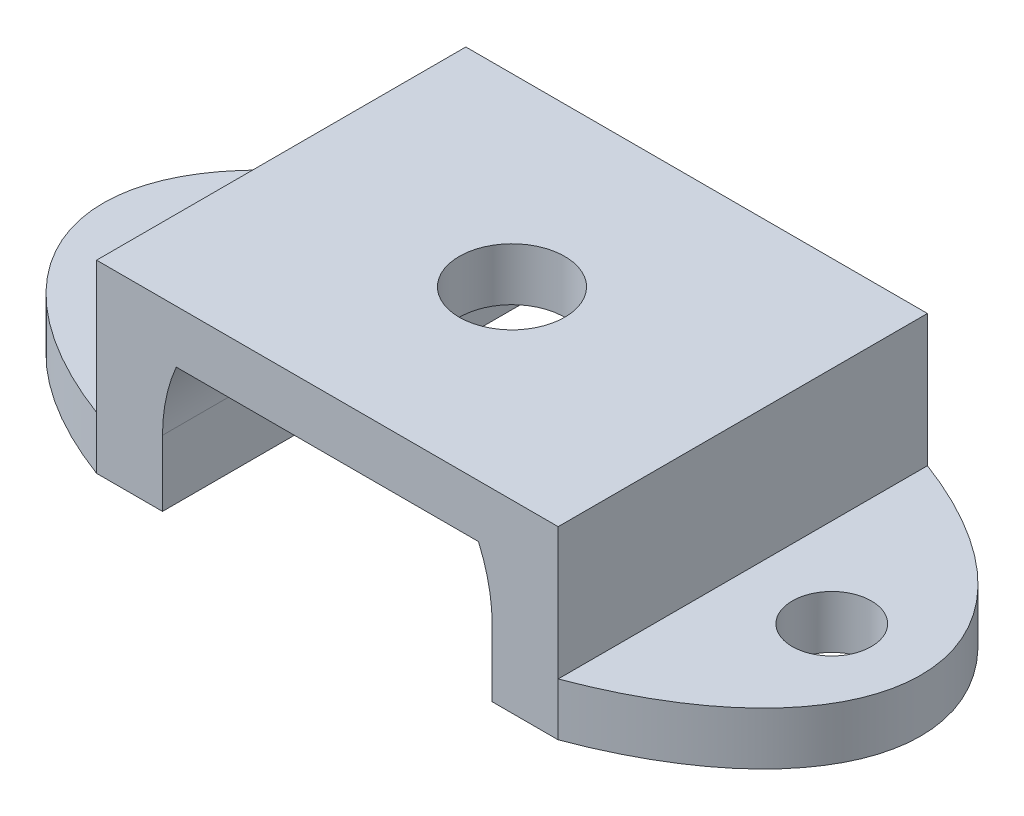
ISO-10303-21;
HEADER;
FILE_DESCRIPTION(('STEP AP214'),'2;1');
FILE_NAME('part.step','',(''),(''),'','','');
FILE_SCHEMA(('AUTOMOTIVE_DESIGN { 1 0 10303 214 1 1 1 1 }'));
ENDSEC;
DATA;
#1=APPLICATION_CONTEXT('core data for automotive mechanical design processes');
#2=APPLICATION_PROTOCOL_DEFINITION('international standard','automotive_design',2000,#1);
#3=PRODUCT_CONTEXT('',#1,'mechanical');
#4=PRODUCT('Part','Part','',(#3));
#5=PRODUCT_RELATED_PRODUCT_CATEGORY('part','',(#4));
#6=PRODUCT_DEFINITION_FORMATION('','',#4);
#7=PRODUCT_DEFINITION_CONTEXT('part definition',#1,'design');
#8=PRODUCT_DEFINITION('design','',#6,#7);
#9=PRODUCT_DEFINITION_SHAPE('','',#8);
#10=(LENGTH_UNIT() NAMED_UNIT(*) SI_UNIT(.MILLI.,.METRE.));
#11=(NAMED_UNIT(*) PLANE_ANGLE_UNIT() SI_UNIT($,.RADIAN.));
#12=(NAMED_UNIT(*) SI_UNIT($,.STERADIAN.) SOLID_ANGLE_UNIT());
#13=UNCERTAINTY_MEASURE_WITH_UNIT(LENGTH_MEASURE(1.E-05),#10,'distance_accuracy_value','');
#14=(GEOMETRIC_REPRESENTATION_CONTEXT(3) GLOBAL_UNCERTAINTY_ASSIGNED_CONTEXT((#13)) GLOBAL_UNIT_ASSIGNED_CONTEXT((#10,
#11,#12)) REPRESENTATION_CONTEXT('',''));
#15=CARTESIAN_POINT('',(0.,0.,0.));
#16=DIRECTION('',(0.,0.,1.));
#17=DIRECTION('',(1.,0.,0.));
#18=AXIS2_PLACEMENT_3D('',#15,#16,#17);
#19=CARTESIAN_POINT('',(-15.5,0.,7.));
#20=DIRECTION('',(0.,1.,0.));
#21=DIRECTION('',(0.,0.,1.));
#22=AXIS2_PLACEMENT_3D('',#19,#20,#21);
#23=PLANE('',#22);
#24=CARTESIAN_POINT('',(-12.125,0.,0.));
#25=DIRECTION('',(0.,1.,0.));
#26=DIRECTION('',(0.,0.,1.));
#27=AXIS2_PLACEMENT_3D('',#24,#25,#26);
#28=CIRCLE('',#27,1.5);
#29=CARTESIAN_POINT('',(-12.125,0.,1.5));
#30=VERTEX_POINT('',#29);
#31=EDGE_CURVE('E160',#30,#30,#28,.T.);
#32=ORIENTED_EDGE('',*,*,#31,.T.);
#33=EDGE_LOOP('',(#32));
#34=FACE_BOUND('',#33,.T.);
#35=DIRECTION('',(1.,0.,0.));
#36=VECTOR('',#35,1.);
#37=CARTESIAN_POINT('',(-15.5,0.,7.));
#38=LINE('',#37,#36);
#39=CARTESIAN_POINT('',(-8.75,0.,7.));
#40=VERTEX_POINT('',#39);
#41=CARTESIAN_POINT('',(-6.25,0.,7.));
#42=VERTEX_POINT('',#41);
#43=EDGE_CURVE('E105',#40,#42,#38,.T.);
#44=ORIENTED_EDGE('',*,*,#43,.F.);
#45=CARTESIAN_POINT('',(0.,0.,0.));
#46=DIRECTION('',(0.,1.,0.));
#47=DIRECTION('',(1.,0.,0.));
#48=AXIS2_PLACEMENT_3D('',#45,#46,#47);
#49=ELLIPSE('',#48,15.5,8.48051018946928);
#50=CARTESIAN_POINT('',(-8.75,0.,-7.));
#51=VERTEX_POINT('',#50);
#52=EDGE_CURVE('E244',#51,#40,#49,.T.);
#53=ORIENTED_EDGE('',*,*,#52,.F.);
#54=DIRECTION('',(1.,0.,0.));
#55=VECTOR('',#54,1.);
#56=CARTESIAN_POINT('',(-15.5,0.,-7.));
#57=LINE('',#56,#55);
#58=CARTESIAN_POINT('',(-6.25,0.,-7.));
#59=VERTEX_POINT('',#58);
#60=EDGE_CURVE('E157',#51,#59,#57,.T.);
#61=ORIENTED_EDGE('',*,*,#60,.T.);
#62=DIRECTION('',(0.,0.,-1.));
#63=VECTOR('',#62,1.);
#64=CARTESIAN_POINT('',(-6.25,0.,7.));
#65=LINE('',#64,#63);
#66=EDGE_CURVE('E11',#42,#59,#65,.T.);
#67=ORIENTED_EDGE('',*,*,#66,.F.);
#68=EDGE_LOOP('',(#44,#53,#61,#67));
#69=FACE_BOUND('',#68,.T.);
#70=ADVANCED_FACE('F37',(#34,#69),#23,.F.);
#71=CARTESIAN_POINT('',(6.25,0.,7.));
#72=DIRECTION('',(0.,1.,0.));
#73=DIRECTION('',(0.,0.,1.));
#74=AXIS2_PLACEMENT_3D('',#71,#72,#73);
#75=PLANE('',#74);
#76=CARTESIAN_POINT('',(12.125,0.,0.));
#77=DIRECTION('',(0.,1.,0.));
#78=DIRECTION('',(0.,0.,1.));
#79=AXIS2_PLACEMENT_3D('',#76,#77,#78);
#80=CIRCLE('',#79,1.5);
#81=CARTESIAN_POINT('',(12.125,0.,1.5));
#82=VERTEX_POINT('',#81);
#83=EDGE_CURVE('E228',#82,#82,#80,.T.);
#84=ORIENTED_EDGE('',*,*,#83,.T.);
#85=EDGE_LOOP('',(#84));
#86=FACE_BOUND('',#85,.T.);
#87=CARTESIAN_POINT('',(0.,0.,0.));
#88=DIRECTION('',(0.,1.,0.));
#89=DIRECTION('',(1.,0.,0.));
#90=AXIS2_PLACEMENT_3D('',#87,#88,#89);
#91=ELLIPSE('',#90,15.5,8.48051018946928);
#92=CARTESIAN_POINT('',(8.75,0.,7.));
#93=VERTEX_POINT('',#92);
#94=CARTESIAN_POINT('',(8.75,0.,-7.));
#95=VERTEX_POINT('',#94);
#96=EDGE_CURVE('E51',#93,#95,#91,.T.);
#97=ORIENTED_EDGE('',*,*,#96,.F.);
#98=DIRECTION('',(1.,0.,0.));
#99=VECTOR('',#98,1.);
#100=CARTESIAN_POINT('',(6.25,0.,7.));
#101=LINE('',#100,#99);
#102=CARTESIAN_POINT('',(6.25,0.,7.));
#103=VERTEX_POINT('',#102);
#104=EDGE_CURVE('E129',#103,#93,#101,.T.);
#105=ORIENTED_EDGE('',*,*,#104,.F.);
#106=DIRECTION('',(0.,0.,-1.));
#107=VECTOR('',#106,1.);
#108=CARTESIAN_POINT('',(6.25,0.,7.));
#109=LINE('',#108,#107);
#110=CARTESIAN_POINT('',(6.25,0.,-7.));
#111=VERTEX_POINT('',#110);
#112=EDGE_CURVE('E137',#103,#111,#109,.T.);
#113=ORIENTED_EDGE('',*,*,#112,.T.);
#114=DIRECTION('',(1.,0.,0.));
#115=VECTOR('',#114,1.);
#116=CARTESIAN_POINT('',(6.25,0.,-7.));
#117=LINE('',#116,#115);
#118=EDGE_CURVE('E169',#111,#95,#117,.T.);
#119=ORIENTED_EDGE('',*,*,#118,.T.);
#120=EDGE_LOOP('',(#97,#105,#113,#119));
#121=FACE_BOUND('',#120,.T.);
#122=ADVANCED_FACE('F147',(#86,#121),#75,.F.);
#123=CARTESIAN_POINT('',(15.5,2.,7.));
#124=DIRECTION('',(0.,-1.,0.));
#125=DIRECTION('',(1.,0.,0.));
#126=AXIS2_PLACEMENT_3D('',#123,#124,#125);
#127=PLANE('',#126);
#128=CARTESIAN_POINT('',(12.125,2.00000000000001,0.));
#129=DIRECTION('',(0.,1.,0.));
#130=DIRECTION('',(1.,0.,0.));
#131=AXIS2_PLACEMENT_3D('',#128,#129,#130);
#132=CIRCLE('',#131,1.5);
#133=CARTESIAN_POINT('',(13.625,2.00000000000001,0.));
#134=VERTEX_POINT('',#133);
#135=EDGE_CURVE('E231',#134,#134,#132,.T.);
#136=ORIENTED_EDGE('',*,*,#135,.F.);
#137=EDGE_LOOP('',(#136));
#138=FACE_BOUND('',#137,.T.);
#139=DIRECTION('',(0.,0.,-1.));
#140=VECTOR('',#139,1.);
#141=CARTESIAN_POINT('',(8.75,2.,7.));
#142=LINE('',#141,#140);
#143=CARTESIAN_POINT('',(8.75,2.,7.));
#144=VERTEX_POINT('',#143);
#145=CARTESIAN_POINT('',(8.75,2.,-7.));
#146=VERTEX_POINT('',#145);
#147=EDGE_CURVE('E145',#144,#146,#142,.T.);
#148=ORIENTED_EDGE('',*,*,#147,.F.);
#149=CARTESIAN_POINT('',(0.,2.,0.));
#150=DIRECTION('',(0.,1.,0.));
#151=DIRECTION('',(1.,0.,0.));
#152=AXIS2_PLACEMENT_3D('',#149,#150,#151);
#153=ELLIPSE('',#152,15.5,8.48051018946928);
#154=EDGE_CURVE('E243',#144,#146,#153,.T.);
#155=ORIENTED_EDGE('',*,*,#154,.T.);
#156=EDGE_LOOP('',(#148,#155));
#157=FACE_BOUND('',#156,.T.);
#158=ADVANCED_FACE('F279',(#138,#157),#127,.F.);
#159=CARTESIAN_POINT('',(-8.75,2.,7.));
#160=DIRECTION('',(0.,-1.,0.));
#161=DIRECTION('',(1.,0.,0.));
#162=AXIS2_PLACEMENT_3D('',#159,#160,#161);
#163=PLANE('',#162);
#164=CARTESIAN_POINT('',(-12.125,2.,0.));
#165=DIRECTION('',(0.,1.,0.));
#166=DIRECTION('',(-1.,0.,0.));
#167=AXIS2_PLACEMENT_3D('',#164,#165,#166);
#168=CIRCLE('',#167,1.5);
#169=CARTESIAN_POINT('',(-13.625,2.,0.));
#170=VERTEX_POINT('',#169);
#171=EDGE_CURVE('E225',#170,#170,#168,.T.);
#172=ORIENTED_EDGE('',*,*,#171,.F.);
#173=EDGE_LOOP('',(#172));
#174=FACE_BOUND('',#173,.T.);
#175=CARTESIAN_POINT('',(0.,2.,0.));
#176=DIRECTION('',(0.,1.,0.));
#177=DIRECTION('',(1.,0.,0.));
#178=AXIS2_PLACEMENT_3D('',#175,#176,#177);
#179=ELLIPSE('',#178,15.5,8.48051018946928);
#180=CARTESIAN_POINT('',(-8.75,2.,-7.));
#181=VERTEX_POINT('',#180);
#182=CARTESIAN_POINT('',(-8.75,2.00000000000001,7.));
#183=VERTEX_POINT('',#182);
#184=EDGE_CURVE('E97',#181,#183,#179,.T.);
#185=ORIENTED_EDGE('',*,*,#184,.T.);
#186=DIRECTION('',(0.,0.,-1.));
#187=VECTOR('',#186,1.);
#188=CARTESIAN_POINT('',(-8.75,2.,7.));
#189=LINE('',#188,#187);
#190=EDGE_CURVE('E156',#183,#181,#189,.T.);
#191=ORIENTED_EDGE('',*,*,#190,.T.);
#192=EDGE_LOOP('',(#185,#191));
#193=FACE_BOUND('',#192,.T.);
#194=ADVANCED_FACE('F273',(#174,#193),#163,.F.);
#195=CARTESIAN_POINT('',(0.,2.5,7.));
#196=DIRECTION('',(0.,0.,1.));
#197=DIRECTION('',(1.,0.,0.));
#198=AXIS2_PLACEMENT_3D('',#195,#196,#197);
#199=PLANE('',#198);
#200=ORIENTED_EDGE('',*,*,#104,.T.);
#201=DIRECTION('',(0.,1.,0.));
#202=VECTOR('',#201,1.);
#203=CARTESIAN_POINT('',(8.75,0.,7.));
#204=LINE('',#203,#202);
#205=EDGE_CURVE('E246',#93,#144,#204,.T.);
#206=ORIENTED_EDGE('',*,*,#205,.T.);
#207=DIRECTION('',(0.,1.,0.));
#208=VECTOR('',#207,1.);
#209=CARTESIAN_POINT('',(8.75,2.,7.));
#210=LINE('',#209,#208);
#211=CARTESIAN_POINT('',(8.75,7.,7.));
#212=VERTEX_POINT('',#211);
#213=EDGE_CURVE('E148',#144,#212,#210,.T.);
#214=ORIENTED_EDGE('',*,*,#213,.T.);
#215=DIRECTION('',(-1.,0.,0.));
#216=VECTOR('',#215,1.);
#217=CARTESIAN_POINT('',(8.75,7.,7.));
#218=LINE('',#217,#216);
#219=CARTESIAN_POINT('',(-8.75,7.,7.));
#220=VERTEX_POINT('',#219);
#221=EDGE_CURVE('E60',#212,#220,#218,.T.);
#222=ORIENTED_EDGE('',*,*,#221,.T.);
#223=DIRECTION('',(0.,-1.,0.));
#224=VECTOR('',#223,1.);
#225=CARTESIAN_POINT('',(-8.75,7.,7.));
#226=LINE('',#225,#224);
#227=EDGE_CURVE('E154',#220,#183,#226,.T.);
#228=ORIENTED_EDGE('',*,*,#227,.T.);
#229=DIRECTION('',(0.,1.,0.));
#230=VECTOR('',#229,1.);
#231=CARTESIAN_POINT('',(-8.75,0.,7.));
#232=LINE('',#231,#230);
#233=EDGE_CURVE('E330',#40,#183,#232,.T.);
#234=ORIENTED_EDGE('',*,*,#233,.F.);
#235=ORIENTED_EDGE('',*,*,#43,.T.);
#236=DIRECTION('',(0.,1.,0.));
#237=VECTOR('',#236,1.);
#238=CARTESIAN_POINT('',(-6.25,2.5,7.));
#239=LINE('',#238,#237);
#240=CARTESIAN_POINT('',(-6.25,2.5,7.));
#241=VERTEX_POINT('',#240);
#242=EDGE_CURVE('E220',#42,#241,#239,.T.);
#243=ORIENTED_EDGE('',*,*,#242,.T.);
#244=CARTESIAN_POINT('',(0.,2.5,7.));
#245=DIRECTION('',(0.,0.,-1.));
#246=DIRECTION('',(1.,0.,0.));
#247=AXIS2_PLACEMENT_3D('',#244,#245,#246);
#248=CIRCLE('',#247,6.25);
#249=CARTESIAN_POINT('',(-5.7282196186948,5.,7.));
#250=VERTEX_POINT('',#249);
#251=EDGE_CURVE('E201',#241,#250,#248,.T.);
#252=ORIENTED_EDGE('',*,*,#251,.T.);
#253=DIRECTION('',(1.,0.,0.));
#254=VECTOR('',#253,1.);
#255=CARTESIAN_POINT('',(-5.7282196186948,5.,7.));
#256=LINE('',#255,#254);
#257=CARTESIAN_POINT('',(5.7282196186948,5.,7.));
#258=VERTEX_POINT('',#257);
#259=EDGE_CURVE('E216',#250,#258,#256,.T.);
#260=ORIENTED_EDGE('',*,*,#259,.T.);
#261=CARTESIAN_POINT('',(0.,2.5,7.));
#262=DIRECTION('',(0.,0.,-1.));
#263=DIRECTION('',(1.,0.,0.));
#264=AXIS2_PLACEMENT_3D('',#261,#262,#263);
#265=CIRCLE('',#264,6.25);
#266=CARTESIAN_POINT('',(6.25,2.5,7.));
#267=VERTEX_POINT('',#266);
#268=EDGE_CURVE('E131',#258,#267,#265,.T.);
#269=ORIENTED_EDGE('',*,*,#268,.T.);
#270=DIRECTION('',(0.,-1.,0.));
#271=VECTOR('',#270,1.);
#272=CARTESIAN_POINT('',(6.25,2.5,7.));
#273=LINE('',#272,#271);
#274=EDGE_CURVE('E123',#267,#103,#273,.T.);
#275=ORIENTED_EDGE('',*,*,#274,.T.);
#276=EDGE_LOOP('',(#200,#206,#214,#222,#228,#234,#235,#243,#252,#260,#269,#275));
#277=FACE_BOUND('',#276,.T.);
#278=ADVANCED_FACE('F125',(#277),#199,.T.);
#279=CARTESIAN_POINT('',(0.,2.5,-7.));
#280=DIRECTION('',(0.,0.,1.));
#281=DIRECTION('',(1.,0.,0.));
#282=AXIS2_PLACEMENT_3D('',#279,#280,#281);
#283=PLANE('',#282);
#284=DIRECTION('',(0.,1.,0.));
#285=VECTOR('',#284,1.);
#286=CARTESIAN_POINT('',(8.75,0.,-7.));
#287=LINE('',#286,#285);
#288=EDGE_CURVE('E240',#95,#146,#287,.T.);
#289=ORIENTED_EDGE('',*,*,#288,.F.);
#290=ORIENTED_EDGE('',*,*,#118,.F.);
#291=DIRECTION('',(0.,-1.,0.));
#292=VECTOR('',#291,1.);
#293=CARTESIAN_POINT('',(6.25,2.5,-7.));
#294=LINE('',#293,#292);
#295=CARTESIAN_POINT('',(6.25,2.5,-7.));
#296=VERTEX_POINT('',#295);
#297=EDGE_CURVE('E140',#296,#111,#294,.T.);
#298=ORIENTED_EDGE('',*,*,#297,.F.);
#299=CARTESIAN_POINT('',(0.,2.5,-7.));
#300=DIRECTION('',(0.,0.,-1.));
#301=DIRECTION('',(1.,0.,0.));
#302=AXIS2_PLACEMENT_3D('',#299,#300,#301);
#303=CIRCLE('',#302,6.25);
#304=CARTESIAN_POINT('',(5.7282196186948,5.,-7.));
#305=VERTEX_POINT('',#304);
#306=EDGE_CURVE('E166',#305,#296,#303,.T.);
#307=ORIENTED_EDGE('',*,*,#306,.F.);
#308=DIRECTION('',(1.,0.,0.));
#309=VECTOR('',#308,1.);
#310=CARTESIAN_POINT('',(-5.7282196186948,5.,-7.));
#311=LINE('',#310,#309);
#312=CARTESIAN_POINT('',(-5.7282196186948,5.,-7.));
#313=VERTEX_POINT('',#312);
#314=EDGE_CURVE('E164',#313,#305,#311,.T.);
#315=ORIENTED_EDGE('',*,*,#314,.F.);
#316=CARTESIAN_POINT('',(0.,2.5,-7.));
#317=DIRECTION('',(0.,0.,-1.));
#318=DIRECTION('',(1.,0.,0.));
#319=AXIS2_PLACEMENT_3D('',#316,#317,#318);
#320=CIRCLE('',#319,6.25);
#321=CARTESIAN_POINT('',(-6.25,2.5,-7.));
#322=VERTEX_POINT('',#321);
#323=EDGE_CURVE('E162',#322,#313,#320,.T.);
#324=ORIENTED_EDGE('',*,*,#323,.F.);
#325=DIRECTION('',(0.,1.,0.));
#326=VECTOR('',#325,1.);
#327=CARTESIAN_POINT('',(-6.25,2.5,-7.));
#328=LINE('',#327,#326);
#329=EDGE_CURVE('E159',#59,#322,#328,.T.);
#330=ORIENTED_EDGE('',*,*,#329,.F.);
#331=ORIENTED_EDGE('',*,*,#60,.F.);
#332=DIRECTION('',(0.,1.,0.));
#333=VECTOR('',#332,1.);
#334=CARTESIAN_POINT('',(-8.75,0.,-7.));
#335=LINE('',#334,#333);
#336=EDGE_CURVE('E241',#51,#181,#335,.T.);
#337=ORIENTED_EDGE('',*,*,#336,.T.);
#338=DIRECTION('',(0.,-1.,0.));
#339=VECTOR('',#338,1.);
#340=CARTESIAN_POINT('',(-8.75,7.,-7.));
#341=LINE('',#340,#339);
#342=CARTESIAN_POINT('',(-8.75,7.,-7.));
#343=VERTEX_POINT('',#342);
#344=EDGE_CURVE('E175',#343,#181,#341,.T.);
#345=ORIENTED_EDGE('',*,*,#344,.F.);
#346=DIRECTION('',(-1.,0.,0.));
#347=VECTOR('',#346,1.);
#348=CARTESIAN_POINT('',(8.75,7.,-7.));
#349=LINE('',#348,#347);
#350=CARTESIAN_POINT('',(8.75,7.,-7.));
#351=VERTEX_POINT('',#350);
#352=EDGE_CURVE('E173',#351,#343,#349,.T.);
#353=ORIENTED_EDGE('',*,*,#352,.F.);
#354=DIRECTION('',(0.,1.,0.));
#355=VECTOR('',#354,1.);
#356=CARTESIAN_POINT('',(8.75,2.,-7.));
#357=LINE('',#356,#355);
#358=EDGE_CURVE('E171',#146,#351,#357,.T.);
#359=ORIENTED_EDGE('',*,*,#358,.F.);
#360=EDGE_LOOP('',(#289,#290,#298,#307,#315,#324,#330,#331,#337,#345,#353,#359));
#361=FACE_BOUND('',#360,.T.);
#362=ADVANCED_FACE('F207',(#361),#283,.F.);
#363=CARTESIAN_POINT('',(-6.25,2.5,7.));
#364=DIRECTION('',(-1.,0.,0.));
#365=DIRECTION('',(0.,-1.,0.));
#366=AXIS2_PLACEMENT_3D('',#363,#364,#365);
#367=PLANE('',#366);
#368=ORIENTED_EDGE('',*,*,#329,.T.);
#369=DIRECTION('',(0.,0.,-1.));
#370=VECTOR('',#369,1.);
#371=CARTESIAN_POINT('',(-6.25,2.5,7.));
#372=LINE('',#371,#370);
#373=EDGE_CURVE('E44',#241,#322,#372,.T.);
#374=ORIENTED_EDGE('',*,*,#373,.F.);
#375=ORIENTED_EDGE('',*,*,#242,.F.);
#376=ORIENTED_EDGE('',*,*,#66,.T.);
#377=EDGE_LOOP('',(#368,#374,#375,#376));
#378=FACE_BOUND('',#377,.T.);
#379=ADVANCED_FACE('F276',(#378),#367,.F.);
#380=CARTESIAN_POINT('',(0.,2.5,7.));
#381=DIRECTION('',(0.,0.,-1.));
#382=DIRECTION('',(-1.,0.,0.));
#383=AXIS2_PLACEMENT_3D('',#380,#381,#382);
#384=CYLINDRICAL_SURFACE('',#383,6.25);
#385=ORIENTED_EDGE('',*,*,#323,.T.);
#386=DIRECTION('',(0.,0.,-1.));
#387=VECTOR('',#386,1.);
#388=CARTESIAN_POINT('',(-5.7282196186948,5.,7.));
#389=LINE('',#388,#387);
#390=EDGE_CURVE('E192',#250,#313,#389,.T.);
#391=ORIENTED_EDGE('',*,*,#390,.F.);
#392=ORIENTED_EDGE('',*,*,#251,.F.);
#393=ORIENTED_EDGE('',*,*,#373,.T.);
#394=EDGE_LOOP('',(#385,#391,#392,#393));
#395=FACE_BOUND('',#394,.T.);
#396=ADVANCED_FACE('F199',(#395),#384,.F.);
#397=CARTESIAN_POINT('',(-5.7282196186948,5.,7.));
#398=DIRECTION('',(0.,1.,0.));
#399=DIRECTION('',(0.,0.,1.));
#400=AXIS2_PLACEMENT_3D('',#397,#398,#399);
#401=PLANE('',#400);
#402=CARTESIAN_POINT('',(0.,5.,0.));
#403=DIRECTION('',(0.,1.,0.));
#404=DIRECTION('',(0.,0.,1.));
#405=AXIS2_PLACEMENT_3D('',#402,#403,#404);
#406=CIRCLE('',#405,2.);
#407=CARTESIAN_POINT('',(0.,5.,2.));
#408=VERTEX_POINT('',#407);
#409=EDGE_CURVE('E234',#408,#408,#406,.T.);
#410=ORIENTED_EDGE('',*,*,#409,.T.);
#411=EDGE_LOOP('',(#410));
#412=FACE_BOUND('',#411,.T.);
#413=ORIENTED_EDGE('',*,*,#314,.T.);
#414=DIRECTION('',(0.,0.,-1.));
#415=VECTOR('',#414,1.);
#416=CARTESIAN_POINT('',(5.7282196186948,5.,7.));
#417=LINE('',#416,#415);
#418=EDGE_CURVE('E189',#258,#305,#417,.T.);
#419=ORIENTED_EDGE('',*,*,#418,.F.);
#420=ORIENTED_EDGE('',*,*,#259,.F.);
#421=ORIENTED_EDGE('',*,*,#390,.T.);
#422=EDGE_LOOP('',(#413,#419,#420,#421));
#423=FACE_BOUND('',#422,.T.);
#424=ADVANCED_FACE('F212',(#412,#423),#401,.F.);
#425=CARTESIAN_POINT('',(0.,2.5,7.));
#426=DIRECTION('',(0.,0.,-1.));
#427=DIRECTION('',(-1.,0.,0.));
#428=AXIS2_PLACEMENT_3D('',#425,#426,#427);
#429=CYLINDRICAL_SURFACE('',#428,6.25);
#430=ORIENTED_EDGE('',*,*,#306,.T.);
#431=DIRECTION('',(0.,0.,-1.));
#432=VECTOR('',#431,1.);
#433=CARTESIAN_POINT('',(6.25,2.5,7.));
#434=LINE('',#433,#432);
#435=EDGE_CURVE('E144',#267,#296,#434,.T.);
#436=ORIENTED_EDGE('',*,*,#435,.F.);
#437=ORIENTED_EDGE('',*,*,#268,.F.);
#438=ORIENTED_EDGE('',*,*,#418,.T.);
#439=EDGE_LOOP('',(#430,#436,#437,#438));
#440=FACE_BOUND('',#439,.T.);
#441=ADVANCED_FACE('F215',(#440),#429,.F.);
#442=CARTESIAN_POINT('',(6.25,2.5,7.));
#443=DIRECTION('',(1.,0.,0.));
#444=DIRECTION('',(0.,1.,0.));
#445=AXIS2_PLACEMENT_3D('',#442,#443,#444);
#446=PLANE('',#445);
#447=ORIENTED_EDGE('',*,*,#297,.T.);
#448=ORIENTED_EDGE('',*,*,#112,.F.);
#449=ORIENTED_EDGE('',*,*,#274,.F.);
#450=ORIENTED_EDGE('',*,*,#435,.T.);
#451=EDGE_LOOP('',(#447,#448,#449,#450));
#452=FACE_BOUND('',#451,.T.);
#453=ADVANCED_FACE('F138',(#452),#446,.F.);
#454=CARTESIAN_POINT('',(8.75,2.,7.));
#455=DIRECTION('',(-1.,0.,0.));
#456=DIRECTION('',(0.,-1.,0.));
#457=AXIS2_PLACEMENT_3D('',#454,#455,#456);
#458=PLANE('',#457);
#459=ORIENTED_EDGE('',*,*,#358,.T.);
#460=DIRECTION('',(0.,0.,-1.));
#461=VECTOR('',#460,1.);
#462=CARTESIAN_POINT('',(8.75,7.,7.));
#463=LINE('',#462,#461);
#464=EDGE_CURVE('E183',#212,#351,#463,.T.);
#465=ORIENTED_EDGE('',*,*,#464,.F.);
#466=ORIENTED_EDGE('',*,*,#213,.F.);
#467=ORIENTED_EDGE('',*,*,#147,.T.);
#468=EDGE_LOOP('',(#459,#465,#466,#467));
#469=FACE_BOUND('',#468,.T.);
#470=ADVANCED_FACE('F287',(#469),#458,.F.);
#471=CARTESIAN_POINT('',(8.75,7.,7.));
#472=DIRECTION('',(0.,-1.,0.));
#473=DIRECTION('',(0.,0.,-1.));
#474=AXIS2_PLACEMENT_3D('',#471,#472,#473);
#475=PLANE('',#474);
#476=CARTESIAN_POINT('',(0.,7.,0.));
#477=DIRECTION('',(0.,1.,0.));
#478=DIRECTION('',(0.,0.,1.));
#479=AXIS2_PLACEMENT_3D('',#476,#477,#478);
#480=CIRCLE('',#479,2.);
#481=CARTESIAN_POINT('',(0.,7.,2.));
#482=VERTEX_POINT('',#481);
#483=EDGE_CURVE('E237',#482,#482,#480,.T.);
#484=ORIENTED_EDGE('',*,*,#483,.F.);
#485=EDGE_LOOP('',(#484));
#486=FACE_BOUND('',#485,.T.);
#487=ORIENTED_EDGE('',*,*,#352,.T.);
#488=DIRECTION('',(0.,0.,-1.));
#489=VECTOR('',#488,1.);
#490=CARTESIAN_POINT('',(-8.75,7.,7.));
#491=LINE('',#490,#489);
#492=EDGE_CURVE('E180',#220,#343,#491,.T.);
#493=ORIENTED_EDGE('',*,*,#492,.F.);
#494=ORIENTED_EDGE('',*,*,#221,.F.);
#495=ORIENTED_EDGE('',*,*,#464,.T.);
#496=EDGE_LOOP('',(#487,#493,#494,#495));
#497=FACE_BOUND('',#496,.T.);
#498=ADVANCED_FACE('F283',(#486,#497),#475,.F.);
#499=CARTESIAN_POINT('',(-8.75,7.,7.));
#500=DIRECTION('',(1.,0.,0.));
#501=DIRECTION('',(0.,1.,0.));
#502=AXIS2_PLACEMENT_3D('',#499,#500,#501);
#503=PLANE('',#502);
#504=ORIENTED_EDGE('',*,*,#344,.T.);
#505=ORIENTED_EDGE('',*,*,#190,.F.);
#506=ORIENTED_EDGE('',*,*,#227,.F.);
#507=ORIENTED_EDGE('',*,*,#492,.T.);
#508=EDGE_LOOP('',(#504,#505,#506,#507));
#509=FACE_BOUND('',#508,.T.);
#510=ADVANCED_FACE('F269',(#509),#503,.F.);
#511=CARTESIAN_POINT('',(-12.125,-6.5,0.));
#512=DIRECTION('',(0.,1.,0.));
#513=DIRECTION('',(-1.,0.,0.));
#514=AXIS2_PLACEMENT_3D('',#511,#512,#513);
#515=CYLINDRICAL_SURFACE('',#514,1.5);
#516=ORIENTED_EDGE('',*,*,#171,.T.);
#517=EDGE_LOOP('',(#516));
#518=FACE_BOUND('',#517,.T.);
#519=ORIENTED_EDGE('',*,*,#31,.F.);
#520=EDGE_LOOP('',(#519));
#521=FACE_BOUND('',#520,.T.);
#522=ADVANCED_FACE('F265',(#518,#521),#515,.F.);
#523=CARTESIAN_POINT('',(12.125,-6.49999999999999,0.));
#524=DIRECTION('',(0.,1.,0.));
#525=DIRECTION('',(-1.,0.,0.));
#526=AXIS2_PLACEMENT_3D('',#523,#524,#525);
#527=CYLINDRICAL_SURFACE('',#526,1.5);
#528=ORIENTED_EDGE('',*,*,#135,.T.);
#529=EDGE_LOOP('',(#528));
#530=FACE_BOUND('',#529,.T.);
#531=ORIENTED_EDGE('',*,*,#83,.F.);
#532=EDGE_LOOP('',(#531));
#533=FACE_BOUND('',#532,.T.);
#534=ADVANCED_FACE('F261',(#530,#533),#527,.F.);
#535=CARTESIAN_POINT('',(0.,0.,0.));
#536=DIRECTION('',(0.,1.,0.));
#537=DIRECTION('',(0.,0.,1.));
#538=AXIS2_PLACEMENT_3D('',#535,#536,#537);
#539=CYLINDRICAL_SURFACE('',#538,2.);
#540=ORIENTED_EDGE('',*,*,#483,.T.);
#541=EDGE_LOOP('',(#540));
#542=FACE_BOUND('',#541,.T.);
#543=ORIENTED_EDGE('',*,*,#409,.F.);
#544=EDGE_LOOP('',(#543));
#545=FACE_BOUND('',#544,.T.);
#546=ADVANCED_FACE('F257',(#542,#545),#539,.F.);
#547=DIRECTION('',(0.,1.,0.));
#548=VECTOR('',#547,1.);
#549=SURFACE_OF_LINEAR_EXTRUSION('',#49,#548);
#550=ORIENTED_EDGE('',*,*,#184,.F.);
#551=ORIENTED_EDGE('',*,*,#336,.F.);
#552=ORIENTED_EDGE('',*,*,#52,.T.);
#553=ORIENTED_EDGE('',*,*,#233,.T.);
#554=EDGE_LOOP('',(#550,#551,#552,#553));
#555=FACE_BOUND('',#554,.T.);
#556=ADVANCED_FACE('F252',(#555),#549,.T.);
#557=DIRECTION('',(0.,1.,0.));
#558=VECTOR('',#557,1.);
#559=SURFACE_OF_LINEAR_EXTRUSION('',#91,#558);
#560=ORIENTED_EDGE('',*,*,#154,.F.);
#561=ORIENTED_EDGE('',*,*,#205,.F.);
#562=ORIENTED_EDGE('',*,*,#96,.T.);
#563=ORIENTED_EDGE('',*,*,#288,.T.);
#564=EDGE_LOOP('',(#560,#561,#562,#563));
#565=FACE_BOUND('',#564,.T.);
#566=ADVANCED_FACE('F256',(#565),#559,.T.);
#567=CLOSED_SHELL('',(#70,#122,#158,#194,#278,#362,#379,#396,#424,#441,#453,#470,#498,#510,#522,
#534,#546,#556,#566));
#568=MANIFOLD_SOLID_BREP('B2',#567);
#569=ADVANCED_BREP_SHAPE_REPRESENTATION('',(#18,#568),#14);
#570=SHAPE_DEFINITION_REPRESENTATION(#9,#569);
ENDSEC;
END-ISO-10303-21;
